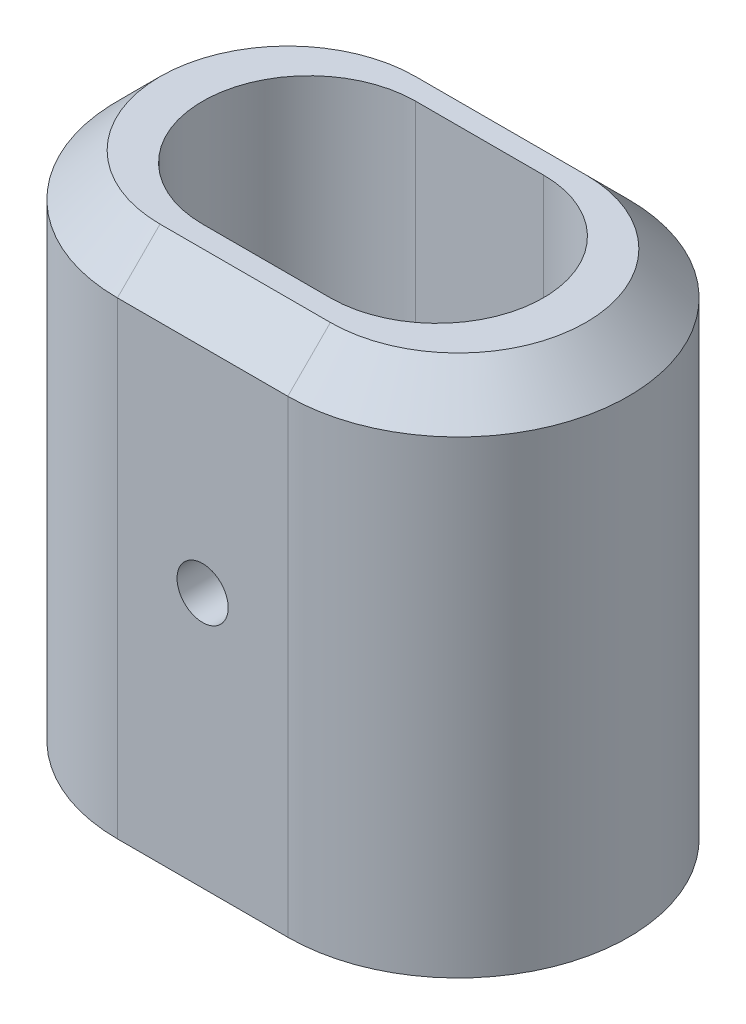
ISO-10303-21;
HEADER;
FILE_DESCRIPTION(('STEP AP214'),'2;1');
FILE_NAME('part.step','',(''),(''),'','','');
FILE_SCHEMA(('AUTOMOTIVE_DESIGN { 1 0 10303 214 1 1 1 1 }'));
ENDSEC;
DATA;
#1=APPLICATION_CONTEXT('core data for automotive mechanical design processes');
#2=APPLICATION_PROTOCOL_DEFINITION('international standard','automotive_design',2000,#1);
#3=PRODUCT_CONTEXT('',#1,'mechanical');
#4=PRODUCT('Part','Part','',(#3));
#5=PRODUCT_RELATED_PRODUCT_CATEGORY('part','',(#4));
#6=PRODUCT_DEFINITION_FORMATION('','',#4);
#7=PRODUCT_DEFINITION_CONTEXT('part definition',#1,'design');
#8=PRODUCT_DEFINITION('design','',#6,#7);
#9=PRODUCT_DEFINITION_SHAPE('','',#8);
#10=(LENGTH_UNIT() NAMED_UNIT(*) SI_UNIT(.MILLI.,.METRE.));
#11=(NAMED_UNIT(*) PLANE_ANGLE_UNIT() SI_UNIT($,.RADIAN.));
#12=(NAMED_UNIT(*) SI_UNIT($,.STERADIAN.) SOLID_ANGLE_UNIT());
#13=UNCERTAINTY_MEASURE_WITH_UNIT(LENGTH_MEASURE(1.E-05),#10,'distance_accuracy_value','');
#14=(GEOMETRIC_REPRESENTATION_CONTEXT(3) GLOBAL_UNCERTAINTY_ASSIGNED_CONTEXT((#13)) GLOBAL_UNIT_ASSIGNED_CONTEXT((#10,
#11,#12)) REPRESENTATION_CONTEXT('',''));
#15=CARTESIAN_POINT('',(0.,0.,0.));
#16=DIRECTION('',(0.,0.,1.));
#17=DIRECTION('',(1.,0.,0.));
#18=AXIS2_PLACEMENT_3D('',#15,#16,#17);
#19=CARTESIAN_POINT('',(30.,-30.,20.));
#20=DIRECTION('',(0.,1.,0.));
#21=DIRECTION('',(-1.,0.,0.));
#22=AXIS2_PLACEMENT_3D('',#19,#20,#21);
#23=PLANE('',#22);
#24=CARTESIAN_POINT('',(10.,-30.,0.));
#25=DIRECTION('',(0.,-1.,0.));
#26=DIRECTION('',(1.,0.,0.));
#27=AXIS2_PLACEMENT_3D('',#24,#25,#26);
#28=CIRCLE('',#27,20.);
#29=CARTESIAN_POINT('',(10.,-30.,20.));
#30=VERTEX_POINT('',#29);
#31=CARTESIAN_POINT('',(10.,-30.,-20.));
#32=VERTEX_POINT('',#31);
#33=EDGE_CURVE('E187',#30,#32,#28,.F.);
#34=ORIENTED_EDGE('',*,*,#33,.F.);
#35=DIRECTION('',(1.,0.,0.));
#36=VECTOR('',#35,1.);
#37=CARTESIAN_POINT('',(30.,-30.,20.));
#38=LINE('',#37,#36);
#39=CARTESIAN_POINT('',(-9.99999999999999,-30.,20.));
#40=VERTEX_POINT('',#39);
#41=EDGE_CURVE('E201',#40,#30,#38,.T.);
#42=ORIENTED_EDGE('',*,*,#41,.F.);
#43=CARTESIAN_POINT('',(-9.99999999999999,-30.,0.));
#44=DIRECTION('',(0.,-1.,0.));
#45=DIRECTION('',(1.,0.,0.));
#46=AXIS2_PLACEMENT_3D('',#43,#44,#45);
#47=CIRCLE('',#46,20.);
#48=CARTESIAN_POINT('',(-9.99999999999999,-30.,-20.));
#49=VERTEX_POINT('',#48);
#50=EDGE_CURVE('E182',#40,#49,#47,.T.);
#51=ORIENTED_EDGE('',*,*,#50,.T.);
#52=DIRECTION('',(1.,0.,0.));
#53=VECTOR('',#52,1.);
#54=CARTESIAN_POINT('',(30.,-30.,-20.));
#55=LINE('',#54,#53);
#56=EDGE_CURVE('E195',#49,#32,#55,.T.);
#57=ORIENTED_EDGE('',*,*,#56,.T.);
#58=EDGE_LOOP('',(#34,#42,#51,#57));
#59=FACE_BOUND('',#58,.T.);
#60=CARTESIAN_POINT('',(7.4993826113528,-30.,0.));
#61=DIRECTION('',(0.,-1.,0.));
#62=DIRECTION('',(1.,0.,0.));
#63=AXIS2_PLACEMENT_3D('',#60,#61,#62);
#64=CIRCLE('',#63,12.5);
#65=CARTESIAN_POINT('',(7.4993826113528,-30.,12.5));
#66=VERTEX_POINT('',#65);
#67=CARTESIAN_POINT('',(7.4993826113528,-30.,-12.5));
#68=VERTEX_POINT('',#67);
#69=EDGE_CURVE('E59',#66,#68,#64,.F.);
#70=ORIENTED_EDGE('',*,*,#69,.T.);
#71=DIRECTION('',(-1.,0.,0.));
#72=VECTOR('',#71,1.);
#73=CARTESIAN_POINT('',(0.,-30.,-12.5));
#74=LINE('',#73,#72);
#75=CARTESIAN_POINT('',(-7.4993826113528,-30.,-12.5));
#76=VERTEX_POINT('',#75);
#77=EDGE_CURVE('E142',#68,#76,#74,.T.);
#78=ORIENTED_EDGE('',*,*,#77,.T.);
#79=CARTESIAN_POINT('',(-7.4993826113528,-30.,0.));
#80=DIRECTION('',(0.,-1.,0.));
#81=DIRECTION('',(1.,0.,0.));
#82=AXIS2_PLACEMENT_3D('',#79,#80,#81);
#83=CIRCLE('',#82,12.5);
#84=CARTESIAN_POINT('',(-7.4993826113528,-30.,12.5));
#85=VERTEX_POINT('',#84);
#86=EDGE_CURVE('E146',#85,#76,#83,.T.);
#87=ORIENTED_EDGE('',*,*,#86,.F.);
#88=DIRECTION('',(-1.,0.,0.));
#89=VECTOR('',#88,1.);
#90=CARTESIAN_POINT('',(0.,-30.,12.5));
#91=LINE('',#90,#89);
#92=EDGE_CURVE('E155',#66,#85,#91,.T.);
#93=ORIENTED_EDGE('',*,*,#92,.F.);
#94=EDGE_LOOP('',(#70,#78,#87,#93));
#95=FACE_BOUND('',#94,.T.);
#96=ADVANCED_FACE('F40',(#59,#95),#23,.F.);
#97=CARTESIAN_POINT('',(30.,30.,20.));
#98=DIRECTION('',(0.,-1.,0.));
#99=DIRECTION('',(1.,0.,0.));
#100=AXIS2_PLACEMENT_3D('',#97,#98,#99);
#101=PLANE('',#100);
#102=CARTESIAN_POINT('',(-10.,30.,0.));
#103=DIRECTION('',(0.,-1.,0.));
#104=DIRECTION('',(1.,0.,0.));
#105=AXIS2_PLACEMENT_3D('',#102,#103,#104);
#106=CIRCLE('',#105,15.);
#107=CARTESIAN_POINT('',(-10.,30.,-15.));
#108=VERTEX_POINT('',#107);
#109=CARTESIAN_POINT('',(-10.,30.,15.));
#110=VERTEX_POINT('',#109);
#111=EDGE_CURVE('E215',#108,#110,#106,.F.);
#112=ORIENTED_EDGE('',*,*,#111,.T.);
#113=DIRECTION('',(1.,0.,0.));
#114=VECTOR('',#113,1.);
#115=CARTESIAN_POINT('',(10.,30.,15.));
#116=LINE('',#115,#114);
#117=CARTESIAN_POINT('',(9.99999999999999,30.,15.));
#118=VERTEX_POINT('',#117);
#119=EDGE_CURVE('E221',#110,#118,#116,.T.);
#120=ORIENTED_EDGE('',*,*,#119,.T.);
#121=CARTESIAN_POINT('',(9.99999999999999,30.,0.));
#122=DIRECTION('',(0.,-1.,0.));
#123=DIRECTION('',(1.,0.,0.));
#124=AXIS2_PLACEMENT_3D('',#121,#122,#123);
#125=CIRCLE('',#124,15.);
#126=CARTESIAN_POINT('',(9.99999999999999,30.,-15.));
#127=VERTEX_POINT('',#126);
#128=EDGE_CURVE('E218',#118,#127,#125,.F.);
#129=ORIENTED_EDGE('',*,*,#128,.T.);
#130=DIRECTION('',(-1.,0.,0.));
#131=VECTOR('',#130,1.);
#132=CARTESIAN_POINT('',(30.,30.,-15.));
#133=LINE('',#132,#131);
#134=EDGE_CURVE('E212',#127,#108,#133,.T.);
#135=ORIENTED_EDGE('',*,*,#134,.T.);
#136=EDGE_LOOP('',(#112,#120,#129,#135));
#137=FACE_BOUND('',#136,.T.);
#138=CARTESIAN_POINT('',(7.4993826113528,30.,0.));
#139=DIRECTION('',(0.,-1.,0.));
#140=DIRECTION('',(1.,0.,0.));
#141=AXIS2_PLACEMENT_3D('',#138,#139,#140);
#142=CIRCLE('',#141,12.5);
#143=CARTESIAN_POINT('',(7.4993826113528,30.,12.5));
#144=VERTEX_POINT('',#143);
#145=CARTESIAN_POINT('',(7.4993826113528,30.,-12.5));
#146=VERTEX_POINT('',#145);
#147=EDGE_CURVE('E123',#144,#146,#142,.F.);
#148=ORIENTED_EDGE('',*,*,#147,.F.);
#149=DIRECTION('',(-1.,0.,0.));
#150=VECTOR('',#149,1.);
#151=CARTESIAN_POINT('',(0.,30.,12.5));
#152=LINE('',#151,#150);
#153=CARTESIAN_POINT('',(-7.4993826113528,30.,12.5));
#154=VERTEX_POINT('',#153);
#155=EDGE_CURVE('E133',#144,#154,#152,.T.);
#156=ORIENTED_EDGE('',*,*,#155,.T.);
#157=CARTESIAN_POINT('',(-7.49938261135281,30.,0.));
#158=DIRECTION('',(0.,-1.,0.));
#159=DIRECTION('',(1.,0.,0.));
#160=AXIS2_PLACEMENT_3D('',#157,#158,#159);
#161=CIRCLE('',#160,12.5);
#162=CARTESIAN_POINT('',(-7.49938261135281,30.,-12.5));
#163=VERTEX_POINT('',#162);
#164=EDGE_CURVE('E67',#154,#163,#161,.T.);
#165=ORIENTED_EDGE('',*,*,#164,.T.);
#166=DIRECTION('',(-1.,0.,0.));
#167=VECTOR('',#166,1.);
#168=CARTESIAN_POINT('',(0.,30.,-12.5));
#169=LINE('',#168,#167);
#170=EDGE_CURVE('E130',#146,#163,#169,.T.);
#171=ORIENTED_EDGE('',*,*,#170,.F.);
#172=EDGE_LOOP('',(#148,#156,#165,#171));
#173=FACE_BOUND('',#172,.T.);
#174=ADVANCED_FACE('F140',(#137,#173),#101,.F.);
#175=CARTESIAN_POINT('',(0.,0.,20.));
#176=DIRECTION('',(0.,0.,-1.));
#177=DIRECTION('',(-1.,0.,0.));
#178=AXIS2_PLACEMENT_3D('',#175,#176,#177);
#179=CYLINDRICAL_SURFACE('',#178,3.);
#180=CARTESIAN_POINT('',(0.,0.,-20.));
#181=DIRECTION('',(0.,0.,-1.));
#182=DIRECTION('',(-1.,0.,0.));
#183=AXIS2_PLACEMENT_3D('',#180,#181,#182);
#184=CIRCLE('',#183,3.);
#185=CARTESIAN_POINT('',(-3.,0.,-20.));
#186=VERTEX_POINT('',#185);
#187=EDGE_CURVE('E175',#186,#186,#184,.T.);
#188=ORIENTED_EDGE('',*,*,#187,.T.);
#189=EDGE_LOOP('',(#188));
#190=FACE_BOUND('',#189,.T.);
#191=CARTESIAN_POINT('',(0.,0.,-12.5));
#192=DIRECTION('',(0.,0.,1.));
#193=DIRECTION('',(1.,0.,0.));
#194=AXIS2_PLACEMENT_3D('',#191,#192,#193);
#195=CIRCLE('',#194,3.);
#196=CARTESIAN_POINT('',(3.,0.,-12.5));
#197=VERTEX_POINT('',#196);
#198=EDGE_CURVE('E45',#197,#197,#195,.F.);
#199=ORIENTED_EDGE('',*,*,#198,.F.);
#200=EDGE_LOOP('',(#199));
#201=FACE_BOUND('',#200,.T.);
#202=ADVANCED_FACE('F251',(#190,#201),#179,.F.);
#203=CARTESIAN_POINT('',(0.,0.,20.));
#204=DIRECTION('',(0.,0.,1.));
#205=DIRECTION('',(1.,0.,0.));
#206=AXIS2_PLACEMENT_3D('',#203,#204,#205);
#207=PLANE('',#206);
#208=CARTESIAN_POINT('',(0.,0.,20.));
#209=DIRECTION('',(0.,0.,-1.));
#210=DIRECTION('',(-1.,0.,0.));
#211=AXIS2_PLACEMENT_3D('',#208,#209,#210);
#212=CIRCLE('',#211,3.);
#213=CARTESIAN_POINT('',(-3.,0.,20.));
#214=VERTEX_POINT('',#213);
#215=EDGE_CURVE('E170',#214,#214,#212,.T.);
#216=ORIENTED_EDGE('',*,*,#215,.T.);
#217=EDGE_LOOP('',(#216));
#218=FACE_BOUND('',#217,.T.);
#219=DIRECTION('',(0.,-1.,0.));
#220=VECTOR('',#219,1.);
#221=CARTESIAN_POINT('',(9.99999999999999,58.2842712474619,20.));
#222=LINE('',#221,#220);
#223=CARTESIAN_POINT('',(9.99999999999999,25.,20.));
#224=VERTEX_POINT('',#223);
#225=EDGE_CURVE('E179',#224,#30,#222,.T.);
#226=ORIENTED_EDGE('',*,*,#225,.F.);
#227=DIRECTION('',(-1.,0.,0.));
#228=VECTOR('',#227,1.);
#229=CARTESIAN_POINT('',(-9.99999999999999,25.,20.));
#230=LINE('',#229,#228);
#231=CARTESIAN_POINT('',(-10.,25.,20.));
#232=VERTEX_POINT('',#231);
#233=EDGE_CURVE('E205',#224,#232,#230,.T.);
#234=ORIENTED_EDGE('',*,*,#233,.T.);
#235=DIRECTION('',(0.,-1.,0.));
#236=VECTOR('',#235,1.);
#237=CARTESIAN_POINT('',(-10.,58.2842712474619,20.));
#238=LINE('',#237,#236);
#239=EDGE_CURVE('E183',#232,#40,#238,.T.);
#240=ORIENTED_EDGE('',*,*,#239,.T.);
#241=ORIENTED_EDGE('',*,*,#41,.T.);
#242=EDGE_LOOP('',(#226,#234,#240,#241));
#243=FACE_BOUND('',#242,.T.);
#244=ADVANCED_FACE('F253',(#218,#243),#207,.T.);
#245=CARTESIAN_POINT('',(0.,0.,-20.));
#246=DIRECTION('',(0.,0.,1.));
#247=DIRECTION('',(1.,0.,0.));
#248=AXIS2_PLACEMENT_3D('',#245,#246,#247);
#249=PLANE('',#248);
#250=ORIENTED_EDGE('',*,*,#187,.F.);
#251=EDGE_LOOP('',(#250));
#252=FACE_BOUND('',#251,.T.);
#253=DIRECTION('',(0.,-1.,0.));
#254=VECTOR('',#253,1.);
#255=CARTESIAN_POINT('',(-10.,58.2842712474619,-20.));
#256=LINE('',#255,#254);
#257=CARTESIAN_POINT('',(-10.,25.,-20.));
#258=VERTEX_POINT('',#257);
#259=EDGE_CURVE('E192',#258,#49,#256,.T.);
#260=ORIENTED_EDGE('',*,*,#259,.F.);
#261=DIRECTION('',(1.,0.,0.));
#262=VECTOR('',#261,1.);
#263=CARTESIAN_POINT('',(0.,25.,-20.));
#264=LINE('',#263,#262);
#265=CARTESIAN_POINT('',(9.99999999999999,25.,-20.));
#266=VERTEX_POINT('',#265);
#267=EDGE_CURVE('E11',#258,#266,#264,.T.);
#268=ORIENTED_EDGE('',*,*,#267,.T.);
#269=DIRECTION('',(0.,-1.,0.));
#270=VECTOR('',#269,1.);
#271=CARTESIAN_POINT('',(9.99999999999999,58.2842712474619,-20.));
#272=LINE('',#271,#270);
#273=EDGE_CURVE('E191',#266,#32,#272,.T.);
#274=ORIENTED_EDGE('',*,*,#273,.T.);
#275=ORIENTED_EDGE('',*,*,#56,.F.);
#276=EDGE_LOOP('',(#260,#268,#274,#275));
#277=FACE_BOUND('',#276,.T.);
#278=ADVANCED_FACE('F261',(#252,#277),#249,.F.);
#279=CARTESIAN_POINT('',(-10.,58.2842712474619,0.));
#280=DIRECTION('',(0.,-1.,0.));
#281=DIRECTION('',(1.,0.,0.));
#282=AXIS2_PLACEMENT_3D('',#279,#280,#281);
#283=CYLINDRICAL_SURFACE('',#282,20.);
#284=ORIENTED_EDGE('',*,*,#239,.F.);
#285=CARTESIAN_POINT('',(-10.,25.,0.));
#286=DIRECTION('',(0.,-1.,0.));
#287=DIRECTION('',(0.,0.,-1.));
#288=AXIS2_PLACEMENT_3D('',#285,#286,#287);
#289=CIRCLE('',#288,20.);
#290=EDGE_CURVE('E51',#232,#258,#289,.T.);
#291=ORIENTED_EDGE('',*,*,#290,.T.);
#292=ORIENTED_EDGE('',*,*,#259,.T.);
#293=ORIENTED_EDGE('',*,*,#50,.F.);
#294=EDGE_LOOP('',(#284,#291,#292,#293));
#295=FACE_BOUND('',#294,.T.);
#296=ADVANCED_FACE('F320',(#295),#283,.T.);
#297=CARTESIAN_POINT('',(9.99999999999999,58.2842712474619,0.));
#298=DIRECTION('',(0.,-1.,0.));
#299=DIRECTION('',(1.,0.,0.));
#300=AXIS2_PLACEMENT_3D('',#297,#298,#299);
#301=CYLINDRICAL_SURFACE('',#300,20.);
#302=ORIENTED_EDGE('',*,*,#273,.F.);
#303=CARTESIAN_POINT('',(9.99999999999999,25.,0.));
#304=DIRECTION('',(0.,-1.,0.));
#305=DIRECTION('',(0.,0.,-1.));
#306=AXIS2_PLACEMENT_3D('',#303,#304,#305);
#307=CIRCLE('',#306,20.);
#308=EDGE_CURVE('E225',#266,#224,#307,.T.);
#309=ORIENTED_EDGE('',*,*,#308,.T.);
#310=ORIENTED_EDGE('',*,*,#225,.T.);
#311=ORIENTED_EDGE('',*,*,#33,.T.);
#312=EDGE_LOOP('',(#302,#309,#310,#311));
#313=FACE_BOUND('',#312,.T.);
#314=ADVANCED_FACE('F300',(#313),#301,.T.);
#315=CARTESIAN_POINT('',(30.,30.,-15.));
#316=DIRECTION('',(0.,-0.707106781186546,0.707106781186548));
#317=DIRECTION('',(-1.,0.,0.));
#318=AXIS2_PLACEMENT_3D('',#315,#316,#317);
#319=PLANE('',#318);
#320=DIRECTION('',(0.,-0.707106781186549,-0.707106781186546));
#321=VECTOR('',#320,1.);
#322=CARTESIAN_POINT('',(-10.,30.,-15.));
#323=LINE('',#322,#321);
#324=EDGE_CURVE('E235',#108,#258,#323,.T.);
#325=ORIENTED_EDGE('',*,*,#324,.F.);
#326=ORIENTED_EDGE('',*,*,#134,.F.);
#327=DIRECTION('',(0.,0.707106781186548,0.707106781186546));
#328=VECTOR('',#327,1.);
#329=CARTESIAN_POINT('',(9.99999999999999,25.,-20.));
#330=LINE('',#329,#328);
#331=EDGE_CURVE('E186',#266,#127,#330,.T.);
#332=ORIENTED_EDGE('',*,*,#331,.F.);
#333=ORIENTED_EDGE('',*,*,#267,.F.);
#334=EDGE_LOOP('',(#325,#326,#332,#333));
#335=FACE_BOUND('',#334,.T.);
#336=ADVANCED_FACE('F43',(#335),#319,.F.);
#337=CARTESIAN_POINT('',(9.99999999999999,25.,0.));
#338=DIRECTION('',(0.,-1.,0.));
#339=DIRECTION('',(0.,0.,-1.));
#340=AXIS2_PLACEMENT_3D('',#337,#338,#339);
#341=CONICAL_SURFACE('',#340,20.,0.785398163397447);
#342=ORIENTED_EDGE('',*,*,#331,.T.);
#343=ORIENTED_EDGE('',*,*,#128,.F.);
#344=DIRECTION('',(0.,0.707106781186548,-0.707106781186547));
#345=VECTOR('',#344,1.);
#346=CARTESIAN_POINT('',(9.99999999999999,25.,20.));
#347=LINE('',#346,#345);
#348=EDGE_CURVE('E232',#224,#118,#347,.T.);
#349=ORIENTED_EDGE('',*,*,#348,.F.);
#350=ORIENTED_EDGE('',*,*,#308,.F.);
#351=EDGE_LOOP('',(#342,#343,#349,#350));
#352=FACE_BOUND('',#351,.T.);
#353=ADVANCED_FACE('F291',(#352),#341,.T.);
#354=CARTESIAN_POINT('',(-10.,30.,0.));
#355=DIRECTION('',(0.,-1.,0.));
#356=DIRECTION('',(0.,0.,-1.));
#357=AXIS2_PLACEMENT_3D('',#354,#355,#356);
#358=CONICAL_SURFACE('',#357,15.,0.785398163397447);
#359=ORIENTED_EDGE('',*,*,#324,.T.);
#360=ORIENTED_EDGE('',*,*,#290,.F.);
#361=DIRECTION('',(0.,-0.707106781186549,0.707106781186546));
#362=VECTOR('',#361,1.);
#363=CARTESIAN_POINT('',(-10.,30.,15.));
#364=LINE('',#363,#362);
#365=EDGE_CURVE('E174',#110,#232,#364,.T.);
#366=ORIENTED_EDGE('',*,*,#365,.F.);
#367=ORIENTED_EDGE('',*,*,#111,.F.);
#368=EDGE_LOOP('',(#359,#360,#366,#367));
#369=FACE_BOUND('',#368,.T.);
#370=ADVANCED_FACE('F285',(#369),#358,.T.);
#371=CARTESIAN_POINT('',(0.,25.,20.));
#372=DIRECTION('',(0.,0.707106781186546,0.707106781186548));
#373=DIRECTION('',(1.,0.,0.));
#374=AXIS2_PLACEMENT_3D('',#371,#372,#373);
#375=PLANE('',#374);
#376=ORIENTED_EDGE('',*,*,#348,.T.);
#377=ORIENTED_EDGE('',*,*,#119,.F.);
#378=ORIENTED_EDGE('',*,*,#365,.T.);
#379=ORIENTED_EDGE('',*,*,#233,.F.);
#380=EDGE_LOOP('',(#376,#377,#378,#379));
#381=FACE_BOUND('',#380,.T.);
#382=ADVANCED_FACE('F269',(#381),#375,.T.);
#383=CARTESIAN_POINT('',(0.,0.,12.5));
#384=DIRECTION('',(0.,0.,1.));
#385=DIRECTION('',(1.,0.,0.));
#386=AXIS2_PLACEMENT_3D('',#383,#384,#385);
#387=CIRCLE('',#386,3.);
#388=CARTESIAN_POINT('',(3.,0.,12.5));
#389=VERTEX_POINT('',#388);
#390=EDGE_CURVE('E164',#389,#389,#387,.F.);
#391=ORIENTED_EDGE('',*,*,#390,.T.);
#392=EDGE_LOOP('',(#391));
#393=FACE_BOUND('',#392,.T.);
#394=ORIENTED_EDGE('',*,*,#215,.F.);
#395=EDGE_LOOP('',(#394));
#396=FACE_BOUND('',#395,.T.);
#397=ADVANCED_FACE('F256',(#393,#396),#179,.F.);
#398=CARTESIAN_POINT('',(0.,30.,-12.5));
#399=DIRECTION('',(0.,0.,1.));
#400=DIRECTION('',(1.,0.,0.));
#401=AXIS2_PLACEMENT_3D('',#398,#399,#400);
#402=PLANE('',#401);
#403=ORIENTED_EDGE('',*,*,#77,.F.);
#404=DIRECTION('',(0.,-1.,0.));
#405=VECTOR('',#404,1.);
#406=CARTESIAN_POINT('',(7.4993826113528,30.,-12.5));
#407=LINE('',#406,#405);
#408=EDGE_CURVE('E161',#146,#68,#407,.T.);
#409=ORIENTED_EDGE('',*,*,#408,.F.);
#410=ORIENTED_EDGE('',*,*,#170,.T.);
#411=DIRECTION('',(0.,-1.,0.));
#412=VECTOR('',#411,1.);
#413=CARTESIAN_POINT('',(-7.49938261135281,30.,-12.5));
#414=LINE('',#413,#412);
#415=EDGE_CURVE('E165',#163,#76,#414,.T.);
#416=ORIENTED_EDGE('',*,*,#415,.T.);
#417=EDGE_LOOP('',(#403,#409,#410,#416));
#418=FACE_BOUND('',#417,.T.);
#419=ORIENTED_EDGE('',*,*,#198,.T.);
#420=EDGE_LOOP('',(#419));
#421=FACE_BOUND('',#420,.T.);
#422=ADVANCED_FACE('F249',(#418,#421),#402,.T.);
#423=CARTESIAN_POINT('',(0.,30.,12.5));
#424=DIRECTION('',(0.,0.,1.));
#425=DIRECTION('',(1.,0.,0.));
#426=AXIS2_PLACEMENT_3D('',#423,#424,#425);
#427=PLANE('',#426);
#428=ORIENTED_EDGE('',*,*,#92,.T.);
#429=DIRECTION('',(0.,-1.,0.));
#430=VECTOR('',#429,1.);
#431=CARTESIAN_POINT('',(-7.49938261135281,30.,12.5));
#432=LINE('',#431,#430);
#433=EDGE_CURVE('E129',#154,#85,#432,.T.);
#434=ORIENTED_EDGE('',*,*,#433,.F.);
#435=ORIENTED_EDGE('',*,*,#155,.F.);
#436=DIRECTION('',(0.,-1.,0.));
#437=VECTOR('',#436,1.);
#438=CARTESIAN_POINT('',(7.4993826113528,30.,12.5));
#439=LINE('',#438,#437);
#440=EDGE_CURVE('E119',#144,#66,#439,.T.);
#441=ORIENTED_EDGE('',*,*,#440,.T.);
#442=EDGE_LOOP('',(#428,#434,#435,#441));
#443=FACE_BOUND('',#442,.T.);
#444=ORIENTED_EDGE('',*,*,#390,.F.);
#445=EDGE_LOOP('',(#444));
#446=FACE_BOUND('',#445,.T.);
#447=ADVANCED_FACE('F134',(#443,#446),#427,.F.);
#448=CARTESIAN_POINT('',(7.4993826113528,30.,0.));
#449=DIRECTION('',(0.,-1.,0.));
#450=DIRECTION('',(1.,0.,0.));
#451=AXIS2_PLACEMENT_3D('',#448,#449,#450);
#452=CYLINDRICAL_SURFACE('',#451,12.5);
#453=ORIENTED_EDGE('',*,*,#69,.F.);
#454=ORIENTED_EDGE('',*,*,#440,.F.);
#455=ORIENTED_EDGE('',*,*,#147,.T.);
#456=ORIENTED_EDGE('',*,*,#408,.T.);
#457=EDGE_LOOP('',(#453,#454,#455,#456));
#458=FACE_BOUND('',#457,.T.);
#459=ADVANCED_FACE('F121',(#458),#452,.F.);
#460=CARTESIAN_POINT('',(-7.49938261135281,30.,0.));
#461=DIRECTION('',(0.,-1.,0.));
#462=DIRECTION('',(1.,0.,0.));
#463=AXIS2_PLACEMENT_3D('',#460,#461,#462);
#464=CYLINDRICAL_SURFACE('',#463,12.5);
#465=ORIENTED_EDGE('',*,*,#86,.T.);
#466=ORIENTED_EDGE('',*,*,#415,.F.);
#467=ORIENTED_EDGE('',*,*,#164,.F.);
#468=ORIENTED_EDGE('',*,*,#433,.T.);
#469=EDGE_LOOP('',(#465,#466,#467,#468));
#470=FACE_BOUND('',#469,.T.);
#471=ADVANCED_FACE('F415',(#470),#464,.F.);
#472=CLOSED_SHELL('',(#96,#174,#202,#244,#278,#296,#314,#336,#353,#370,#382,#397,#422,#447,#459,#471));
#473=MANIFOLD_SOLID_BREP('B2',#472);
#474=ADVANCED_BREP_SHAPE_REPRESENTATION('',(#18,#473),#14);
#475=SHAPE_DEFINITION_REPRESENTATION(#9,#474);
ENDSEC;
END-ISO-10303-21;
